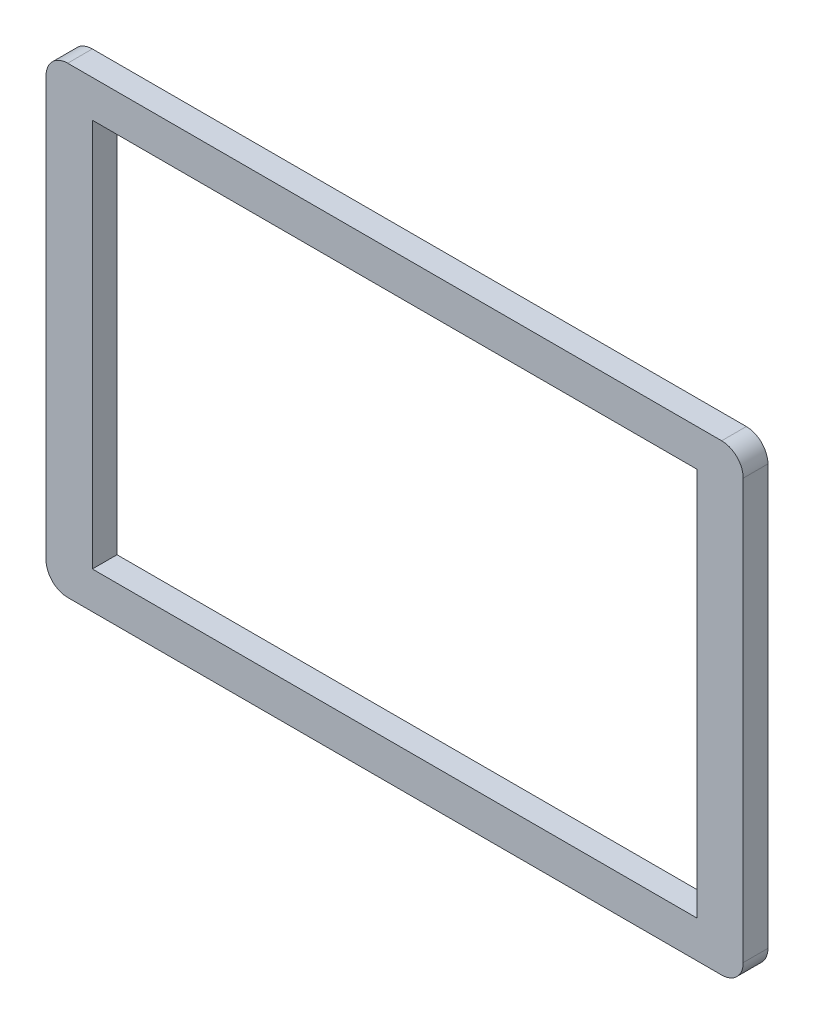
ISO-10303-21;
HEADER;
FILE_DESCRIPTION(('STEP AP214'),'2;1');
FILE_NAME('part.step','',(''),(''),'','','');
FILE_SCHEMA(('AUTOMOTIVE_DESIGN { 1 0 10303 214 1 1 1 1 }'));
ENDSEC;
DATA;
#1=APPLICATION_CONTEXT('core data for automotive mechanical design processes');
#2=APPLICATION_PROTOCOL_DEFINITION('international standard','automotive_design',2000,#1);
#3=PRODUCT_CONTEXT('',#1,'mechanical');
#4=PRODUCT('Part','Part','',(#3));
#5=PRODUCT_RELATED_PRODUCT_CATEGORY('part','',(#4));
#6=PRODUCT_DEFINITION_FORMATION('','',#4);
#7=PRODUCT_DEFINITION_CONTEXT('part definition',#1,'design');
#8=PRODUCT_DEFINITION('design','',#6,#7);
#9=PRODUCT_DEFINITION_SHAPE('','',#8);
#10=(LENGTH_UNIT() NAMED_UNIT(*) SI_UNIT(.MILLI.,.METRE.));
#11=(NAMED_UNIT(*) PLANE_ANGLE_UNIT() SI_UNIT($,.RADIAN.));
#12=(NAMED_UNIT(*) SI_UNIT($,.STERADIAN.) SOLID_ANGLE_UNIT());
#13=UNCERTAINTY_MEASURE_WITH_UNIT(LENGTH_MEASURE(1.E-05),#10,'distance_accuracy_value','');
#14=(GEOMETRIC_REPRESENTATION_CONTEXT(3) GLOBAL_UNCERTAINTY_ASSIGNED_CONTEXT((#13)) GLOBAL_UNIT_ASSIGNED_CONTEXT((#10,
#11,#12)) REPRESENTATION_CONTEXT('',''));
#15=CARTESIAN_POINT('',(0.,0.,0.));
#16=DIRECTION('',(0.,0.,1.));
#17=DIRECTION('',(1.,0.,0.));
#18=AXIS2_PLACEMENT_3D('',#15,#16,#17);
#19=CARTESIAN_POINT('',(0.,0.,4.));
#20=DIRECTION('',(0.,0.,1.));
#21=DIRECTION('',(1.,0.,0.));
#22=AXIS2_PLACEMENT_3D('',#19,#20,#21);
#23=PLANE('',#22);
#24=DIRECTION('',(-1.,0.,0.));
#25=VECTOR('',#24,1.);
#26=CARTESIAN_POINT('',(-82.5209507435224,40.8430782656183,4.));
#27=LINE('',#26,#25);
#28=CARTESIAN_POINT('',(26.9790492564776,40.8430782656183,4.));
#29=VERTEX_POINT('',#28);
#30=CARTESIAN_POINT('',(-79.0209507435224,40.8430782656183,4.));
#31=VERTEX_POINT('',#30);
#32=EDGE_CURVE('E179',#29,#31,#27,.T.);
#33=ORIENTED_EDGE('',*,*,#32,.T.);
#34=CARTESIAN_POINT('',(-79.0209507435224,37.3430782656183,4.));
#35=DIRECTION('',(0.,0.,1.));
#36=DIRECTION('',(1.,0.,0.));
#37=AXIS2_PLACEMENT_3D('',#34,#35,#36);
#38=CIRCLE('',#37,3.5);
#39=CARTESIAN_POINT('',(-82.5209507435224,37.3430782656183,4.));
#40=VERTEX_POINT('',#39);
#41=EDGE_CURVE('E214',#31,#40,#38,.T.);
#42=ORIENTED_EDGE('',*,*,#41,.T.);
#43=DIRECTION('',(0.,-1.,0.));
#44=VECTOR('',#43,1.);
#45=CARTESIAN_POINT('',(-82.5209507435224,40.8430782656183,4.));
#46=LINE('',#45,#44);
#47=CARTESIAN_POINT('',(-82.5209507435224,-30.6569217343817,4.));
#48=VERTEX_POINT('',#47);
#49=EDGE_CURVE('E171',#40,#48,#46,.T.);
#50=ORIENTED_EDGE('',*,*,#49,.T.);
#51=CARTESIAN_POINT('',(-79.0209507435224,-30.6569217343817,4.));
#52=DIRECTION('',(0.,0.,1.));
#53=DIRECTION('',(1.,0.,0.));
#54=AXIS2_PLACEMENT_3D('',#51,#52,#53);
#55=CIRCLE('',#54,3.5);
#56=CARTESIAN_POINT('',(-79.0209507435224,-34.1569217343817,4.));
#57=VERTEX_POINT('',#56);
#58=EDGE_CURVE('E212',#48,#57,#55,.T.);
#59=ORIENTED_EDGE('',*,*,#58,.T.);
#60=DIRECTION('',(1.,0.,0.));
#61=VECTOR('',#60,1.);
#62=CARTESIAN_POINT('',(-82.5209507435224,-34.1569217343817,4.));
#63=LINE('',#62,#61);
#64=CARTESIAN_POINT('',(26.9790492564776,-34.1569217343817,4.));
#65=VERTEX_POINT('',#64);
#66=EDGE_CURVE('E174',#57,#65,#63,.T.);
#67=ORIENTED_EDGE('',*,*,#66,.T.);
#68=CARTESIAN_POINT('',(26.9790492564776,-30.6569217343817,4.));
#69=DIRECTION('',(0.,0.,1.));
#70=DIRECTION('',(1.,0.,0.));
#71=AXIS2_PLACEMENT_3D('',#68,#69,#70);
#72=CIRCLE('',#71,3.5);
#73=CARTESIAN_POINT('',(30.4790492564776,-30.6569217343817,4.));
#74=VERTEX_POINT('',#73);
#75=EDGE_CURVE('E60',#65,#74,#72,.T.);
#76=ORIENTED_EDGE('',*,*,#75,.T.);
#77=DIRECTION('',(0.,1.,0.));
#78=VECTOR('',#77,1.);
#79=CARTESIAN_POINT('',(30.4790492564775,40.8430782656183,4.));
#80=LINE('',#79,#78);
#81=CARTESIAN_POINT('',(30.4790492564775,37.3430782656183,4.));
#82=VERTEX_POINT('',#81);
#83=EDGE_CURVE('E177',#74,#82,#80,.T.);
#84=ORIENTED_EDGE('',*,*,#83,.T.);
#85=CARTESIAN_POINT('',(26.9790492564776,37.3430782656183,4.));
#86=DIRECTION('',(0.,0.,1.));
#87=DIRECTION('',(1.,0.,0.));
#88=AXIS2_PLACEMENT_3D('',#85,#86,#87);
#89=CIRCLE('',#88,3.5);
#90=EDGE_CURVE('E209',#82,#29,#89,.T.);
#91=ORIENTED_EDGE('',*,*,#90,.T.);
#92=EDGE_LOOP('',(#33,#42,#50,#59,#67,#76,#84,#91));
#93=FACE_BOUND('',#92,.T.);
#94=DIRECTION('',(1.,0.,0.));
#95=VECTOR('',#94,1.);
#96=CARTESIAN_POINT('',(-75.0209507435224,-28.1569217343817,4.));
#97=LINE('',#96,#95);
#98=CARTESIAN_POINT('',(-75.0209507435224,-28.1569217343817,4.));
#99=VERTEX_POINT('',#98);
#100=CARTESIAN_POINT('',(22.9790492564776,-28.1569217343817,4.));
#101=VERTEX_POINT('',#100);
#102=EDGE_CURVE('E140',#99,#101,#97,.T.);
#103=ORIENTED_EDGE('',*,*,#102,.F.);
#104=DIRECTION('',(0.,-1.,0.));
#105=VECTOR('',#104,1.);
#106=CARTESIAN_POINT('',(-75.0209507435224,34.8430782656183,4.));
#107=LINE('',#106,#105);
#108=CARTESIAN_POINT('',(-75.0209507435224,34.8430782656183,4.));
#109=VERTEX_POINT('',#108);
#110=EDGE_CURVE('E130',#109,#99,#107,.T.);
#111=ORIENTED_EDGE('',*,*,#110,.F.);
#112=DIRECTION('',(-1.,0.,0.));
#113=VECTOR('',#112,1.);
#114=CARTESIAN_POINT('',(-75.0209507435224,34.8430782656183,4.));
#115=LINE('',#114,#113);
#116=CARTESIAN_POINT('',(22.9790492564776,34.8430782656183,4.));
#117=VERTEX_POINT('',#116);
#118=EDGE_CURVE('E155',#117,#109,#115,.T.);
#119=ORIENTED_EDGE('',*,*,#118,.F.);
#120=DIRECTION('',(0.,1.,0.));
#121=VECTOR('',#120,1.);
#122=CARTESIAN_POINT('',(22.9790492564776,34.8430782656183,4.));
#123=LINE('',#122,#121);
#124=EDGE_CURVE('E153',#101,#117,#123,.T.);
#125=ORIENTED_EDGE('',*,*,#124,.F.);
#126=EDGE_LOOP('',(#103,#111,#119,#125));
#127=FACE_BOUND('',#126,.T.);
#128=ADVANCED_FACE('F39',(#93,#127),#23,.T.);
#129=CARTESIAN_POINT('',(0.,0.,0.));
#130=DIRECTION('',(0.,0.,1.));
#131=DIRECTION('',(1.,0.,0.));
#132=AXIS2_PLACEMENT_3D('',#129,#130,#131);
#133=PLANE('',#132);
#134=DIRECTION('',(0.,-1.,0.));
#135=VECTOR('',#134,1.);
#136=CARTESIAN_POINT('',(-82.5209507435224,40.8430782656183,0.));
#137=LINE('',#136,#135);
#138=CARTESIAN_POINT('',(-82.5209507435224,37.3430782656183,0.));
#139=VERTEX_POINT('',#138);
#140=CARTESIAN_POINT('',(-82.5209507435224,-30.6569217343817,0.));
#141=VERTEX_POINT('',#140);
#142=EDGE_CURVE('E148',#139,#141,#137,.T.);
#143=ORIENTED_EDGE('',*,*,#142,.F.);
#144=CARTESIAN_POINT('',(-79.0209507435224,37.3430782656183,0.));
#145=DIRECTION('',(0.,0.,1.));
#146=DIRECTION('',(1.,0.,0.));
#147=AXIS2_PLACEMENT_3D('',#144,#145,#146);
#148=CIRCLE('',#147,3.5);
#149=CARTESIAN_POINT('',(-79.0209507435224,40.8430782656183,0.));
#150=VERTEX_POINT('',#149);
#151=EDGE_CURVE('E202',#139,#150,#148,.F.);
#152=ORIENTED_EDGE('',*,*,#151,.T.);
#153=DIRECTION('',(-1.,0.,0.));
#154=VECTOR('',#153,1.);
#155=CARTESIAN_POINT('',(-82.5209507435224,40.8430782656183,0.));
#156=LINE('',#155,#154);
#157=CARTESIAN_POINT('',(26.9790492564776,40.8430782656183,0.));
#158=VERTEX_POINT('',#157);
#159=EDGE_CURVE('E175',#158,#150,#156,.T.);
#160=ORIENTED_EDGE('',*,*,#159,.F.);
#161=CARTESIAN_POINT('',(26.9790492564776,37.3430782656183,0.));
#162=DIRECTION('',(0.,0.,1.));
#163=DIRECTION('',(1.,0.,0.));
#164=AXIS2_PLACEMENT_3D('',#161,#162,#163);
#165=CIRCLE('',#164,3.5);
#166=CARTESIAN_POINT('',(30.4790492564775,37.3430782656183,0.));
#167=VERTEX_POINT('',#166);
#168=EDGE_CURVE('E196',#158,#167,#165,.F.);
#169=ORIENTED_EDGE('',*,*,#168,.T.);
#170=DIRECTION('',(0.,1.,0.));
#171=VECTOR('',#170,1.);
#172=CARTESIAN_POINT('',(30.4790492564775,40.8430782656183,0.));
#173=LINE('',#172,#171);
#174=CARTESIAN_POINT('',(30.4790492564776,-30.6569217343817,0.));
#175=VERTEX_POINT('',#174);
#176=EDGE_CURVE('E188',#175,#167,#173,.T.);
#177=ORIENTED_EDGE('',*,*,#176,.F.);
#178=CARTESIAN_POINT('',(26.9790492564776,-30.6569217343817,0.));
#179=DIRECTION('',(0.,0.,1.));
#180=DIRECTION('',(1.,0.,0.));
#181=AXIS2_PLACEMENT_3D('',#178,#179,#180);
#182=CIRCLE('',#181,3.5);
#183=CARTESIAN_POINT('',(26.9790492564776,-34.1569217343817,0.));
#184=VERTEX_POINT('',#183);
#185=EDGE_CURVE('E198',#175,#184,#182,.F.);
#186=ORIENTED_EDGE('',*,*,#185,.T.);
#187=DIRECTION('',(1.,0.,0.));
#188=VECTOR('',#187,1.);
#189=CARTESIAN_POINT('',(-82.5209507435224,-34.1569217343817,0.));
#190=LINE('',#189,#188);
#191=CARTESIAN_POINT('',(-79.0209507435224,-34.1569217343817,0.));
#192=VERTEX_POINT('',#191);
#193=EDGE_CURVE('E185',#192,#184,#190,.T.);
#194=ORIENTED_EDGE('',*,*,#193,.F.);
#195=CARTESIAN_POINT('',(-79.0209507435224,-30.6569217343817,0.));
#196=DIRECTION('',(0.,0.,1.));
#197=DIRECTION('',(1.,0.,0.));
#198=AXIS2_PLACEMENT_3D('',#195,#196,#197);
#199=CIRCLE('',#198,3.5);
#200=EDGE_CURVE('E200',#192,#141,#199,.F.);
#201=ORIENTED_EDGE('',*,*,#200,.T.);
#202=EDGE_LOOP('',(#143,#152,#160,#169,#177,#186,#194,#201));
#203=FACE_BOUND('',#202,.T.);
#204=DIRECTION('',(0.,-1.,0.));
#205=VECTOR('',#204,1.);
#206=CARTESIAN_POINT('',(-75.0209507435224,34.8430782656183,0.));
#207=LINE('',#206,#205);
#208=CARTESIAN_POINT('',(-75.0209507435224,34.8430782656183,0.));
#209=VERTEX_POINT('',#208);
#210=CARTESIAN_POINT('',(-75.0209507435224,-28.1569217343817,0.));
#211=VERTEX_POINT('',#210);
#212=EDGE_CURVE('E159',#209,#211,#207,.T.);
#213=ORIENTED_EDGE('',*,*,#212,.T.);
#214=DIRECTION('',(1.,0.,0.));
#215=VECTOR('',#214,1.);
#216=CARTESIAN_POINT('',(-75.0209507435224,-28.1569217343817,0.));
#217=LINE('',#216,#215);
#218=CARTESIAN_POINT('',(22.9790492564776,-28.1569217343817,0.));
#219=VERTEX_POINT('',#218);
#220=EDGE_CURVE('E147',#211,#219,#217,.T.);
#221=ORIENTED_EDGE('',*,*,#220,.T.);
#222=DIRECTION('',(0.,1.,0.));
#223=VECTOR('',#222,1.);
#224=CARTESIAN_POINT('',(22.9790492564776,34.8430782656183,0.));
#225=LINE('',#224,#223);
#226=CARTESIAN_POINT('',(22.9790492564776,34.8430782656183,0.));
#227=VERTEX_POINT('',#226);
#228=EDGE_CURVE('E162',#219,#227,#225,.T.);
#229=ORIENTED_EDGE('',*,*,#228,.T.);
#230=DIRECTION('',(-1.,0.,0.));
#231=VECTOR('',#230,1.);
#232=CARTESIAN_POINT('',(-75.0209507435224,34.8430782656183,0.));
#233=LINE('',#232,#231);
#234=EDGE_CURVE('E141',#227,#209,#233,.T.);
#235=ORIENTED_EDGE('',*,*,#234,.T.);
#236=EDGE_LOOP('',(#213,#221,#229,#235));
#237=FACE_BOUND('',#236,.T.);
#238=ADVANCED_FACE('F230',(#203,#237),#133,.F.);
#239=CARTESIAN_POINT('',(-82.5209507435224,40.8430782656183,4.));
#240=DIRECTION('',(1.,0.,0.));
#241=DIRECTION('',(0.,0.,-1.));
#242=AXIS2_PLACEMENT_3D('',#239,#240,#241);
#243=PLANE('',#242);
#244=ORIENTED_EDGE('',*,*,#49,.F.);
#245=DIRECTION('',(0.,0.,-1.));
#246=VECTOR('',#245,1.);
#247=CARTESIAN_POINT('',(-82.5209507435224,37.3430782656183,4.));
#248=LINE('',#247,#246);
#249=EDGE_CURVE('E193',#40,#139,#248,.T.);
#250=ORIENTED_EDGE('',*,*,#249,.T.);
#251=ORIENTED_EDGE('',*,*,#142,.T.);
#252=DIRECTION('',(0.,0.,-1.));
#253=VECTOR('',#252,1.);
#254=CARTESIAN_POINT('',(-82.5209507435224,-30.6569217343817,4.));
#255=LINE('',#254,#253);
#256=EDGE_CURVE('E182',#141,#48,#255,.F.);
#257=ORIENTED_EDGE('',*,*,#256,.T.);
#258=EDGE_LOOP('',(#244,#250,#251,#257));
#259=FACE_BOUND('',#258,.T.);
#260=ADVANCED_FACE('F251',(#259),#243,.F.);
#261=CARTESIAN_POINT('',(-82.5209507435224,-34.1569217343817,4.));
#262=DIRECTION('',(0.,1.,0.));
#263=DIRECTION('',(-1.,0.,0.));
#264=AXIS2_PLACEMENT_3D('',#261,#262,#263);
#265=PLANE('',#264);
#266=ORIENTED_EDGE('',*,*,#66,.F.);
#267=DIRECTION('',(0.,0.,-1.));
#268=VECTOR('',#267,1.);
#269=CARTESIAN_POINT('',(-79.0209507435224,-34.1569217343817,4.));
#270=LINE('',#269,#268);
#271=EDGE_CURVE('E218',#57,#192,#270,.T.);
#272=ORIENTED_EDGE('',*,*,#271,.T.);
#273=ORIENTED_EDGE('',*,*,#193,.T.);
#274=DIRECTION('',(0.,0.,-1.));
#275=VECTOR('',#274,1.);
#276=CARTESIAN_POINT('',(26.9790492564776,-34.1569217343817,4.));
#277=LINE('',#276,#275);
#278=EDGE_CURVE('E216',#184,#65,#277,.F.);
#279=ORIENTED_EDGE('',*,*,#278,.T.);
#280=EDGE_LOOP('',(#266,#272,#273,#279));
#281=FACE_BOUND('',#280,.T.);
#282=ADVANCED_FACE('F224',(#281),#265,.F.);
#283=CARTESIAN_POINT('',(30.4790492564775,40.8430782656183,4.));
#284=DIRECTION('',(-1.,0.,0.));
#285=DIRECTION('',(0.,-1.,0.));
#286=AXIS2_PLACEMENT_3D('',#283,#284,#285);
#287=PLANE('',#286);
#288=ORIENTED_EDGE('',*,*,#83,.F.);
#289=DIRECTION('',(0.,0.,-1.));
#290=VECTOR('',#289,1.);
#291=CARTESIAN_POINT('',(30.4790492564776,-30.6569217343817,4.));
#292=LINE('',#291,#290);
#293=EDGE_CURVE('E11',#74,#175,#292,.T.);
#294=ORIENTED_EDGE('',*,*,#293,.T.);
#295=ORIENTED_EDGE('',*,*,#176,.T.);
#296=DIRECTION('',(0.,0.,-1.));
#297=VECTOR('',#296,1.);
#298=CARTESIAN_POINT('',(30.4790492564775,37.3430782656183,4.));
#299=LINE('',#298,#297);
#300=EDGE_CURVE('E47',#167,#82,#299,.F.);
#301=ORIENTED_EDGE('',*,*,#300,.T.);
#302=EDGE_LOOP('',(#288,#294,#295,#301));
#303=FACE_BOUND('',#302,.T.);
#304=ADVANCED_FACE('F236',(#303),#287,.F.);
#305=CARTESIAN_POINT('',(-82.5209507435224,40.8430782656183,4.));
#306=DIRECTION('',(0.,-1.,0.));
#307=DIRECTION('',(1.,0.,0.));
#308=AXIS2_PLACEMENT_3D('',#305,#306,#307);
#309=PLANE('',#308);
#310=ORIENTED_EDGE('',*,*,#159,.T.);
#311=DIRECTION('',(0.,0.,-1.));
#312=VECTOR('',#311,1.);
#313=CARTESIAN_POINT('',(-79.0209507435224,40.8430782656183,4.));
#314=LINE('',#313,#312);
#315=EDGE_CURVE('E207',#150,#31,#314,.F.);
#316=ORIENTED_EDGE('',*,*,#315,.T.);
#317=ORIENTED_EDGE('',*,*,#32,.F.);
#318=DIRECTION('',(0.,0.,-1.));
#319=VECTOR('',#318,1.);
#320=CARTESIAN_POINT('',(26.9790492564776,40.8430782656183,4.));
#321=LINE('',#320,#319);
#322=EDGE_CURVE('E204',#29,#158,#321,.T.);
#323=ORIENTED_EDGE('',*,*,#322,.T.);
#324=EDGE_LOOP('',(#310,#316,#317,#323));
#325=FACE_BOUND('',#324,.T.);
#326=ADVANCED_FACE('F243',(#325),#309,.F.);
#327=CARTESIAN_POINT('',(-75.0209507435224,34.8430782656183,4.));
#328=DIRECTION('',(1.,0.,0.));
#329=DIRECTION('',(0.,1.,0.));
#330=AXIS2_PLACEMENT_3D('',#327,#328,#329);
#331=PLANE('',#330);
#332=ORIENTED_EDGE('',*,*,#212,.F.);
#333=DIRECTION('',(0.,0.,-1.));
#334=VECTOR('',#333,1.);
#335=CARTESIAN_POINT('',(-75.0209507435224,34.8430782656183,4.));
#336=LINE('',#335,#334);
#337=EDGE_CURVE('E136',#109,#209,#336,.T.);
#338=ORIENTED_EDGE('',*,*,#337,.F.);
#339=ORIENTED_EDGE('',*,*,#110,.T.);
#340=DIRECTION('',(0.,0.,-1.));
#341=VECTOR('',#340,1.);
#342=CARTESIAN_POINT('',(-75.0209507435224,-28.1569217343817,4.));
#343=LINE('',#342,#341);
#344=EDGE_CURVE('E133',#99,#211,#343,.T.);
#345=ORIENTED_EDGE('',*,*,#344,.T.);
#346=EDGE_LOOP('',(#332,#338,#339,#345));
#347=FACE_BOUND('',#346,.T.);
#348=ADVANCED_FACE('F132',(#347),#331,.T.);
#349=CARTESIAN_POINT('',(-75.0209507435224,-28.1569217343817,4.));
#350=DIRECTION('',(0.,1.,0.));
#351=DIRECTION('',(0.,0.,1.));
#352=AXIS2_PLACEMENT_3D('',#349,#350,#351);
#353=PLANE('',#352);
#354=ORIENTED_EDGE('',*,*,#220,.F.);
#355=ORIENTED_EDGE('',*,*,#344,.F.);
#356=ORIENTED_EDGE('',*,*,#102,.T.);
#357=DIRECTION('',(0.,0.,-1.));
#358=VECTOR('',#357,1.);
#359=CARTESIAN_POINT('',(22.9790492564776,-28.1569217343817,4.));
#360=LINE('',#359,#358);
#361=EDGE_CURVE('E149',#101,#219,#360,.T.);
#362=ORIENTED_EDGE('',*,*,#361,.T.);
#363=EDGE_LOOP('',(#354,#355,#356,#362));
#364=FACE_BOUND('',#363,.T.);
#365=ADVANCED_FACE('F144',(#364),#353,.T.);
#366=CARTESIAN_POINT('',(22.9790492564776,34.8430782656183,4.));
#367=DIRECTION('',(-1.,0.,0.));
#368=DIRECTION('',(0.,-1.,0.));
#369=AXIS2_PLACEMENT_3D('',#366,#367,#368);
#370=PLANE('',#369);
#371=ORIENTED_EDGE('',*,*,#228,.F.);
#372=ORIENTED_EDGE('',*,*,#361,.F.);
#373=ORIENTED_EDGE('',*,*,#124,.T.);
#374=DIRECTION('',(0.,0.,-1.));
#375=VECTOR('',#374,1.);
#376=CARTESIAN_POINT('',(22.9790492564776,34.8430782656183,4.));
#377=LINE('',#376,#375);
#378=EDGE_CURVE('E168',#117,#227,#377,.T.);
#379=ORIENTED_EDGE('',*,*,#378,.T.);
#380=EDGE_LOOP('',(#371,#372,#373,#379));
#381=FACE_BOUND('',#380,.T.);
#382=ADVANCED_FACE('F330',(#381),#370,.T.);
#383=CARTESIAN_POINT('',(-75.0209507435224,34.8430782656183,4.));
#384=DIRECTION('',(0.,-1.,0.));
#385=DIRECTION('',(0.,0.,-1.));
#386=AXIS2_PLACEMENT_3D('',#383,#384,#385);
#387=PLANE('',#386);
#388=ORIENTED_EDGE('',*,*,#234,.F.);
#389=ORIENTED_EDGE('',*,*,#378,.F.);
#390=ORIENTED_EDGE('',*,*,#118,.T.);
#391=ORIENTED_EDGE('',*,*,#337,.T.);
#392=EDGE_LOOP('',(#388,#389,#390,#391));
#393=FACE_BOUND('',#392,.T.);
#394=ADVANCED_FACE('F260',(#393),#387,.T.);
#395=CARTESIAN_POINT('',(-79.0209507435224,37.3430782656183,4.));
#396=DIRECTION('',(0.,0.,-1.));
#397=DIRECTION('',(-1.,0.,0.));
#398=AXIS2_PLACEMENT_3D('',#395,#396,#397);
#399=CYLINDRICAL_SURFACE('',#398,3.5);
#400=ORIENTED_EDGE('',*,*,#41,.F.);
#401=ORIENTED_EDGE('',*,*,#315,.F.);
#402=ORIENTED_EDGE('',*,*,#151,.F.);
#403=ORIENTED_EDGE('',*,*,#249,.F.);
#404=EDGE_LOOP('',(#400,#401,#402,#403));
#405=FACE_BOUND('',#404,.T.);
#406=ADVANCED_FACE('F248',(#405),#399,.T.);
#407=CARTESIAN_POINT('',(-79.0209507435224,-30.6569217343817,4.));
#408=DIRECTION('',(0.,0.,-1.));
#409=DIRECTION('',(-1.,0.,0.));
#410=AXIS2_PLACEMENT_3D('',#407,#408,#409);
#411=CYLINDRICAL_SURFACE('',#410,3.5);
#412=ORIENTED_EDGE('',*,*,#58,.F.);
#413=ORIENTED_EDGE('',*,*,#256,.F.);
#414=ORIENTED_EDGE('',*,*,#200,.F.);
#415=ORIENTED_EDGE('',*,*,#271,.F.);
#416=EDGE_LOOP('',(#412,#413,#414,#415));
#417=FACE_BOUND('',#416,.T.);
#418=ADVANCED_FACE('F253',(#417),#411,.T.);
#419=CARTESIAN_POINT('',(26.9790492564776,-30.6569217343817,4.));
#420=DIRECTION('',(0.,0.,-1.));
#421=DIRECTION('',(-1.,0.,0.));
#422=AXIS2_PLACEMENT_3D('',#419,#420,#421);
#423=CYLINDRICAL_SURFACE('',#422,3.5);
#424=ORIENTED_EDGE('',*,*,#75,.F.);
#425=ORIENTED_EDGE('',*,*,#278,.F.);
#426=ORIENTED_EDGE('',*,*,#185,.F.);
#427=ORIENTED_EDGE('',*,*,#293,.F.);
#428=EDGE_LOOP('',(#424,#425,#426,#427));
#429=FACE_BOUND('',#428,.T.);
#430=ADVANCED_FACE('F235',(#429),#423,.T.);
#431=CARTESIAN_POINT('',(26.9790492564776,37.3430782656183,4.));
#432=DIRECTION('',(0.,0.,-1.));
#433=DIRECTION('',(-1.,0.,0.));
#434=AXIS2_PLACEMENT_3D('',#431,#432,#433);
#435=CYLINDRICAL_SURFACE('',#434,3.5);
#436=ORIENTED_EDGE('',*,*,#90,.F.);
#437=ORIENTED_EDGE('',*,*,#300,.F.);
#438=ORIENTED_EDGE('',*,*,#168,.F.);
#439=ORIENTED_EDGE('',*,*,#322,.F.);
#440=EDGE_LOOP('',(#436,#437,#438,#439));
#441=FACE_BOUND('',#440,.T.);
#442=ADVANCED_FACE('F41',(#441),#435,.T.);
#443=CLOSED_SHELL('',(#128,#238,#260,#282,#304,#326,#348,#365,#382,#394,#406,#418,#430,#442));
#444=MANIFOLD_SOLID_BREP('B2',#443);
#445=ADVANCED_BREP_SHAPE_REPRESENTATION('',(#18,#444),#14);
#446=SHAPE_DEFINITION_REPRESENTATION(#9,#445);
ENDSEC;
END-ISO-10303-21;
